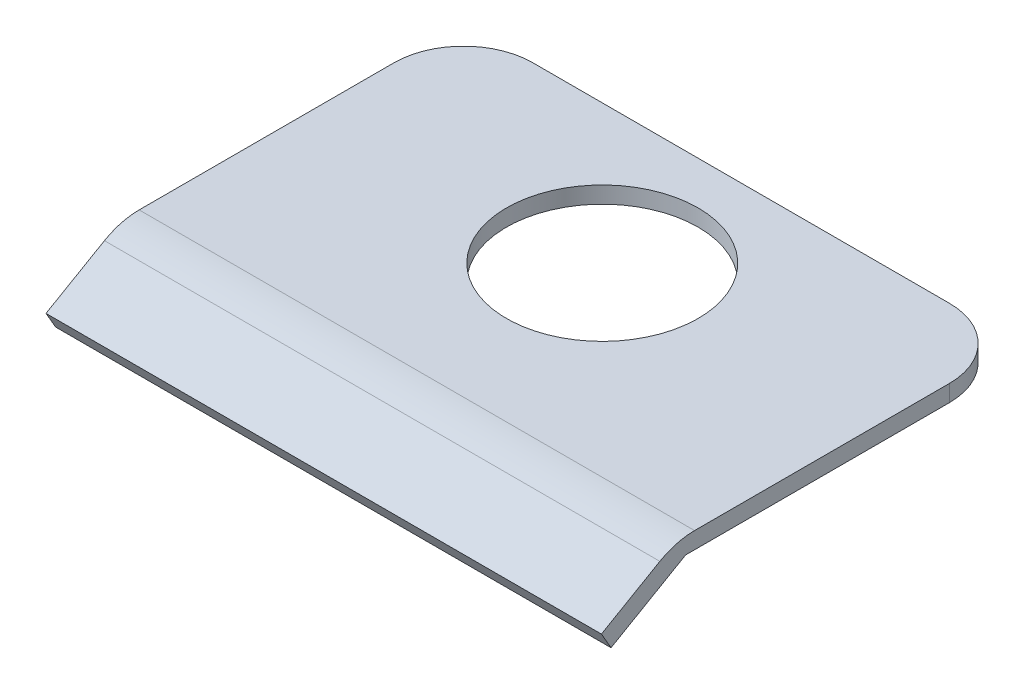
ISO-10303-21;
HEADER;
FILE_DESCRIPTION(('STEP AP214'),'2;1');
FILE_NAME('part.step','',(''),(''),'','','');
FILE_SCHEMA(('AUTOMOTIVE_DESIGN { 1 0 10303 214 1 1 1 1 }'));
ENDSEC;
DATA;
#1=APPLICATION_CONTEXT('core data for automotive mechanical design processes');
#2=APPLICATION_PROTOCOL_DEFINITION('international standard','automotive_design',2000,#1);
#3=PRODUCT_CONTEXT('',#1,'mechanical');
#4=PRODUCT('Part','Part','',(#3));
#5=PRODUCT_RELATED_PRODUCT_CATEGORY('part','',(#4));
#6=PRODUCT_DEFINITION_FORMATION('','',#4);
#7=PRODUCT_DEFINITION_CONTEXT('part definition',#1,'design');
#8=PRODUCT_DEFINITION('design','',#6,#7);
#9=PRODUCT_DEFINITION_SHAPE('','',#8);
#10=(LENGTH_UNIT() NAMED_UNIT(*) SI_UNIT(.MILLI.,.METRE.));
#11=(NAMED_UNIT(*) PLANE_ANGLE_UNIT() SI_UNIT($,.RADIAN.));
#12=(NAMED_UNIT(*) SI_UNIT($,.STERADIAN.) SOLID_ANGLE_UNIT());
#13=UNCERTAINTY_MEASURE_WITH_UNIT(LENGTH_MEASURE(1.E-05),#10,'distance_accuracy_value','');
#14=(GEOMETRIC_REPRESENTATION_CONTEXT(3) GLOBAL_UNCERTAINTY_ASSIGNED_CONTEXT((#13)) GLOBAL_UNIT_ASSIGNED_CONTEXT((#10,
#11,#12)) REPRESENTATION_CONTEXT('',''));
#15=CARTESIAN_POINT('',(0.,0.,0.));
#16=DIRECTION('',(0.,0.,1.));
#17=DIRECTION('',(1.,0.,0.));
#18=AXIS2_PLACEMENT_3D('',#15,#16,#17);
#19=CARTESIAN_POINT('',(0.,1.524,0.));
#20=DIRECTION('',(0.,1.,0.));
#21=DIRECTION('',(0.,0.,1.));
#22=AXIS2_PLACEMENT_3D('',#19,#20,#21);
#23=PLANE('',#22);
#24=DIRECTION('',(0.,0.,1.));
#25=VECTOR('',#24,1.);
#26=CARTESIAN_POINT('',(-25.4,1.524,-15.24));
#27=LINE('',#26,#25);
#28=CARTESIAN_POINT('',(-25.4,1.524,-8.89));
#29=VERTEX_POINT('',#28);
#30=CARTESIAN_POINT('',(-25.4,1.524,14.4184044383074));
#31=VERTEX_POINT('',#30);
#32=EDGE_CURVE('E163',#29,#31,#27,.T.);
#33=ORIENTED_EDGE('',*,*,#32,.T.);
#34=DIRECTION('',(-1.,0.,0.));
#35=VECTOR('',#34,1.);
#36=CARTESIAN_POINT('',(0.,1.524,14.4184044383074));
#37=LINE('',#36,#35);
#38=CARTESIAN_POINT('',(25.4,1.524,14.4184044383073));
#39=VERTEX_POINT('',#38);
#40=EDGE_CURVE('E178',#31,#39,#37,.F.);
#41=ORIENTED_EDGE('',*,*,#40,.T.);
#42=DIRECTION('',(0.,0.,-1.));
#43=VECTOR('',#42,1.);
#44=CARTESIAN_POINT('',(25.4,1.524,-15.24));
#45=LINE('',#44,#43);
#46=CARTESIAN_POINT('',(25.4,1.524,-8.89000000000001));
#47=VERTEX_POINT('',#46);
#48=EDGE_CURVE('E131',#39,#47,#45,.T.);
#49=ORIENTED_EDGE('',*,*,#48,.T.);
#50=CARTESIAN_POINT('',(19.05,1.524,-8.89));
#51=DIRECTION('',(0.,1.,0.));
#52=DIRECTION('',(0.,0.,1.));
#53=AXIS2_PLACEMENT_3D('',#50,#51,#52);
#54=CIRCLE('',#53,6.35);
#55=CARTESIAN_POINT('',(19.05,1.524,-15.24));
#56=VERTEX_POINT('',#55);
#57=EDGE_CURVE('E174',#47,#56,#54,.T.);
#58=ORIENTED_EDGE('',*,*,#57,.T.);
#59=DIRECTION('',(-1.,0.,0.));
#60=VECTOR('',#59,1.);
#61=CARTESIAN_POINT('',(-25.4,1.524,-15.24));
#62=LINE('',#61,#60);
#63=CARTESIAN_POINT('',(-19.05,1.524,-15.24));
#64=VERTEX_POINT('',#63);
#65=EDGE_CURVE('E160',#56,#64,#62,.T.);
#66=ORIENTED_EDGE('',*,*,#65,.T.);
#67=CARTESIAN_POINT('',(-19.05,1.524,-8.89));
#68=DIRECTION('',(0.,1.,0.));
#69=DIRECTION('',(0.,0.,1.));
#70=AXIS2_PLACEMENT_3D('',#67,#68,#69);
#71=CIRCLE('',#70,6.35);
#72=EDGE_CURVE('E176',#64,#29,#71,.T.);
#73=ORIENTED_EDGE('',*,*,#72,.T.);
#74=EDGE_LOOP('',(#33,#41,#49,#58,#66,#73));
#75=FACE_BOUND('',#74,.T.);
#76=CARTESIAN_POINT('',(0.,1.524,-2.54));
#77=DIRECTION('',(0.,1.,0.));
#78=DIRECTION('',(0.,0.,1.));
#79=AXIS2_PLACEMENT_3D('',#76,#77,#78);
#80=CIRCLE('',#79,8.76299999999999);
#81=CARTESIAN_POINT('',(0.,1.524,-11.303));
#82=VERTEX_POINT('',#81);
#83=EDGE_CURVE('E153',#82,#82,#80,.T.);
#84=ORIENTED_EDGE('',*,*,#83,.F.);
#85=EDGE_LOOP('',(#84));
#86=FACE_BOUND('',#85,.T.);
#87=ADVANCED_FACE('F38',(#75,#86),#23,.T.);
#88=CARTESIAN_POINT('',(0.,0.,0.));
#89=DIRECTION('',(0.,1.,0.));
#90=DIRECTION('',(0.,0.,1.));
#91=AXIS2_PLACEMENT_3D('',#88,#89,#90);
#92=PLANE('',#91);
#93=DIRECTION('',(0.,0.,1.));
#94=VECTOR('',#93,1.);
#95=CARTESIAN_POINT('',(-25.4,0.,-15.24));
#96=LINE('',#95,#94);
#97=CARTESIAN_POINT('',(-25.4,0.,-8.89));
#98=VERTEX_POINT('',#97);
#99=CARTESIAN_POINT('',(-25.4,0.,15.24));
#100=VERTEX_POINT('',#99);
#101=EDGE_CURVE('E110',#98,#100,#96,.T.);
#102=ORIENTED_EDGE('',*,*,#101,.F.);
#103=CARTESIAN_POINT('',(-19.05,0.,-8.89));
#104=DIRECTION('',(0.,1.,0.));
#105=DIRECTION('',(0.,0.,1.));
#106=AXIS2_PLACEMENT_3D('',#103,#104,#105);
#107=CIRCLE('',#106,6.35);
#108=CARTESIAN_POINT('',(-19.05,0.,-15.24));
#109=VERTEX_POINT('',#108);
#110=EDGE_CURVE('E53',#98,#109,#107,.F.);
#111=ORIENTED_EDGE('',*,*,#110,.T.);
#112=DIRECTION('',(-1.,0.,0.));
#113=VECTOR('',#112,1.);
#114=CARTESIAN_POINT('',(-25.4,0.,-15.24));
#115=LINE('',#114,#113);
#116=CARTESIAN_POINT('',(19.05,0.,-15.24));
#117=VERTEX_POINT('',#116);
#118=EDGE_CURVE('E121',#117,#109,#115,.T.);
#119=ORIENTED_EDGE('',*,*,#118,.F.);
#120=CARTESIAN_POINT('',(19.05,0.,-8.89));
#121=DIRECTION('',(0.,1.,0.));
#122=DIRECTION('',(0.,0.,1.));
#123=AXIS2_PLACEMENT_3D('',#120,#121,#122);
#124=CIRCLE('',#123,6.35);
#125=CARTESIAN_POINT('',(25.4,0.,-8.89000000000001));
#126=VERTEX_POINT('',#125);
#127=EDGE_CURVE('E61',#117,#126,#124,.F.);
#128=ORIENTED_EDGE('',*,*,#127,.T.);
#129=DIRECTION('',(0.,0.,-1.));
#130=VECTOR('',#129,1.);
#131=CARTESIAN_POINT('',(25.4,0.,-15.24));
#132=LINE('',#131,#130);
#133=CARTESIAN_POINT('',(25.4,0.,15.24));
#134=VERTEX_POINT('',#133);
#135=EDGE_CURVE('E127',#134,#126,#132,.T.);
#136=ORIENTED_EDGE('',*,*,#135,.F.);
#137=DIRECTION('',(1.,0.,0.));
#138=VECTOR('',#137,1.);
#139=CARTESIAN_POINT('',(-25.4,0.,15.24));
#140=LINE('',#139,#138);
#141=EDGE_CURVE('E120',#100,#134,#140,.T.);
#142=ORIENTED_EDGE('',*,*,#141,.F.);
#143=EDGE_LOOP('',(#102,#111,#119,#128,#136,#142));
#144=FACE_BOUND('',#143,.T.);
#145=CARTESIAN_POINT('',(0.,0.,-2.54));
#146=DIRECTION('',(0.,1.,0.));
#147=DIRECTION('',(0.,0.,1.));
#148=AXIS2_PLACEMENT_3D('',#145,#146,#147);
#149=CIRCLE('',#148,8.76299999999999);
#150=CARTESIAN_POINT('',(0.,0.,-11.303));
#151=VERTEX_POINT('',#150);
#152=EDGE_CURVE('E152',#151,#151,#149,.T.);
#153=ORIENTED_EDGE('',*,*,#152,.T.);
#154=EDGE_LOOP('',(#153));
#155=FACE_BOUND('',#154,.T.);
#156=ADVANCED_FACE('F124',(#144,#155),#92,.F.);
#157=CARTESIAN_POINT('',(25.4,1.524,-15.24));
#158=DIRECTION('',(-1.,0.,0.));
#159=DIRECTION('',(0.,0.,1.));
#160=AXIS2_PLACEMENT_3D('',#157,#158,#159);
#161=PLANE('',#160);
#162=ORIENTED_EDGE('',*,*,#48,.F.);
#163=CARTESIAN_POINT('',(25.4,-4.826,14.4184044383074));
#164=DIRECTION('',(-1.,0.,0.));
#165=DIRECTION('',(0.,0.,1.));
#166=AXIS2_PLACEMENT_3D('',#163,#164,#165);
#167=CIRCLE('',#166,6.35);
#168=CARTESIAN_POINT('',(25.4,0.673261314031206,17.5934044383073));
#169=VERTEX_POINT('',#168);
#170=EDGE_CURVE('E182',#39,#169,#167,.F.);
#171=ORIENTED_EDGE('',*,*,#170,.T.);
#172=DIRECTION('',(0.,-0.499999999999995,0.866025403784442));
#173=VECTOR('',#172,1.);
#174=CARTESIAN_POINT('',(25.4,1.524,16.119881810245));
#175=LINE('',#174,#173);
#176=CARTESIAN_POINT('',(25.4,-2.41299999999996,22.9389658396437));
#177=VERTEX_POINT('',#176);
#178=EDGE_CURVE('E142',#169,#177,#175,.T.);
#179=ORIENTED_EDGE('',*,*,#178,.T.);
#180=DIRECTION('',(0.,-0.866025403784442,-0.499999999999995));
#181=VECTOR('',#180,1.);
#182=CARTESIAN_POINT('',(25.4,-3.93699999999995,22.0590840293987));
#183=LINE('',#182,#181);
#184=CARTESIAN_POINT('',(25.4,-3.93699999999995,22.0590840293987));
#185=VERTEX_POINT('',#184);
#186=EDGE_CURVE('E148',#177,#185,#183,.T.);
#187=ORIENTED_EDGE('',*,*,#186,.T.);
#188=DIRECTION('',(0.,0.499999999999994,-0.866025403784442));
#189=VECTOR('',#188,1.);
#190=CARTESIAN_POINT('',(25.4,0.,15.24));
#191=LINE('',#190,#189);
#192=EDGE_CURVE('E150',#185,#134,#191,.T.);
#193=ORIENTED_EDGE('',*,*,#192,.T.);
#194=ORIENTED_EDGE('',*,*,#135,.T.);
#195=DIRECTION('',(0.,-1.,0.));
#196=VECTOR('',#195,1.);
#197=CARTESIAN_POINT('',(25.4,1.524,-8.89));
#198=LINE('',#197,#196);
#199=EDGE_CURVE('E180',#126,#47,#198,.F.);
#200=ORIENTED_EDGE('',*,*,#199,.T.);
#201=EDGE_LOOP('',(#162,#171,#179,#187,#193,#194,#200));
#202=FACE_BOUND('',#201,.T.);
#203=ADVANCED_FACE('F192',(#202),#161,.F.);
#204=CARTESIAN_POINT('',(-25.4,1.524,-15.24));
#205=DIRECTION('',(0.,0.,1.));
#206=DIRECTION('',(1.,0.,0.));
#207=AXIS2_PLACEMENT_3D('',#204,#205,#206);
#208=PLANE('',#207);
#209=ORIENTED_EDGE('',*,*,#118,.T.);
#210=DIRECTION('',(0.,-1.,0.));
#211=VECTOR('',#210,1.);
#212=CARTESIAN_POINT('',(-19.05,1.524,-15.24));
#213=LINE('',#212,#211);
#214=EDGE_CURVE('E11',#109,#64,#213,.F.);
#215=ORIENTED_EDGE('',*,*,#214,.T.);
#216=ORIENTED_EDGE('',*,*,#65,.F.);
#217=DIRECTION('',(0.,-1.,0.));
#218=VECTOR('',#217,1.);
#219=CARTESIAN_POINT('',(19.05,1.524,-15.24));
#220=LINE('',#219,#218);
#221=EDGE_CURVE('E46',#56,#117,#220,.T.);
#222=ORIENTED_EDGE('',*,*,#221,.T.);
#223=EDGE_LOOP('',(#209,#215,#216,#222));
#224=FACE_BOUND('',#223,.T.);
#225=ADVANCED_FACE('F187',(#224),#208,.F.);
#226=CARTESIAN_POINT('',(-25.4,1.524,-15.24));
#227=DIRECTION('',(1.,0.,0.));
#228=DIRECTION('',(0.,0.,-1.));
#229=AXIS2_PLACEMENT_3D('',#226,#227,#228);
#230=PLANE('',#229);
#231=DIRECTION('',(0.,0.499999999999995,-0.866025403784442));
#232=VECTOR('',#231,1.);
#233=CARTESIAN_POINT('',(-25.4,1.524,16.119881810245));
#234=LINE('',#233,#232);
#235=CARTESIAN_POINT('',(-25.4,-2.41299999999996,22.9389658396437));
#236=VERTEX_POINT('',#235);
#237=CARTESIAN_POINT('',(-25.4,0.673261314031205,17.5934044383073));
#238=VERTEX_POINT('',#237);
#239=EDGE_CURVE('E139',#236,#238,#234,.T.);
#240=ORIENTED_EDGE('',*,*,#239,.T.);
#241=CARTESIAN_POINT('',(-25.4,-4.826,14.4184044383074));
#242=DIRECTION('',(1.,0.,0.));
#243=DIRECTION('',(0.,0.,-1.));
#244=AXIS2_PLACEMENT_3D('',#241,#242,#243);
#245=CIRCLE('',#244,6.35);
#246=EDGE_CURVE('E172',#238,#31,#245,.F.);
#247=ORIENTED_EDGE('',*,*,#246,.T.);
#248=ORIENTED_EDGE('',*,*,#32,.F.);
#249=DIRECTION('',(0.,-1.,0.));
#250=VECTOR('',#249,1.);
#251=CARTESIAN_POINT('',(-25.4,1.524,-8.89));
#252=LINE('',#251,#250);
#253=EDGE_CURVE('E119',#29,#98,#252,.T.);
#254=ORIENTED_EDGE('',*,*,#253,.T.);
#255=ORIENTED_EDGE('',*,*,#101,.T.);
#256=DIRECTION('',(0.,-0.499999999999994,0.866025403784442));
#257=VECTOR('',#256,1.);
#258=CARTESIAN_POINT('',(-25.4,0.,15.24));
#259=LINE('',#258,#257);
#260=CARTESIAN_POINT('',(-25.4,-3.93699999999995,22.0590840293987));
#261=VERTEX_POINT('',#260);
#262=EDGE_CURVE('E116',#100,#261,#259,.T.);
#263=ORIENTED_EDGE('',*,*,#262,.T.);
#264=DIRECTION('',(0.,0.866025403784442,0.499999999999994));
#265=VECTOR('',#264,1.);
#266=CARTESIAN_POINT('',(-25.4,-3.93699999999995,22.0590840293987));
#267=LINE('',#266,#265);
#268=EDGE_CURVE('E137',#261,#236,#267,.T.);
#269=ORIENTED_EDGE('',*,*,#268,.T.);
#270=EDGE_LOOP('',(#240,#247,#248,#254,#255,#263,#269));
#271=FACE_BOUND('',#270,.T.);
#272=ADVANCED_FACE('F113',(#271),#230,.F.);
#273=CARTESIAN_POINT('',(0.,1.524,-2.54));
#274=DIRECTION('',(0.,-1.,0.));
#275=DIRECTION('',(0.,0.,-1.));
#276=AXIS2_PLACEMENT_3D('',#273,#274,#275);
#277=CYLINDRICAL_SURFACE('',#276,8.76299999999999);
#278=CARTESIAN_POINT('',(0.,1.524,-11.303));
#279=CARTESIAN_POINT('',(0.,1.508125,-11.303));
#280=CARTESIAN_POINT('',(0.,1.49225,-11.303));
#281=CARTESIAN_POINT('',(0.,1.4605,-11.303));
#282=CARTESIAN_POINT('',(0.,1.444625,-11.303));
#283=CARTESIAN_POINT('',(0.,1.412875,-11.303));
#284=CARTESIAN_POINT('',(0.,1.397,-11.303));
#285=CARTESIAN_POINT('',(0.,1.36525,-11.303));
#286=CARTESIAN_POINT('',(0.,1.349375,-11.303));
#287=CARTESIAN_POINT('',(0.,1.317625,-11.303));
#288=CARTESIAN_POINT('',(0.,1.30175,-11.303));
#289=CARTESIAN_POINT('',(0.,1.27,-11.303));
#290=CARTESIAN_POINT('',(0.,1.254125,-11.303));
#291=CARTESIAN_POINT('',(0.,1.222375,-11.303));
#292=CARTESIAN_POINT('',(0.,1.2065,-11.303));
#293=CARTESIAN_POINT('',(0.,1.17475,-11.303));
#294=CARTESIAN_POINT('',(0.,1.158875,-11.303));
#295=CARTESIAN_POINT('',(0.,1.127125,-11.303));
#296=CARTESIAN_POINT('',(0.,1.11125,-11.303));
#297=CARTESIAN_POINT('',(0.,1.0795,-11.303));
#298=CARTESIAN_POINT('',(0.,1.063625,-11.303));
#299=CARTESIAN_POINT('',(0.,1.031875,-11.303));
#300=CARTESIAN_POINT('',(0.,1.016,-11.303));
#301=CARTESIAN_POINT('',(0.,0.98425,-11.303));
#302=CARTESIAN_POINT('',(0.,0.968375,-11.303));
#303=CARTESIAN_POINT('',(0.,0.936625,-11.303));
#304=CARTESIAN_POINT('',(0.,0.92075,-11.303));
#305=CARTESIAN_POINT('',(0.,0.889,-11.303));
#306=CARTESIAN_POINT('',(0.,0.873125,-11.303));
#307=CARTESIAN_POINT('',(0.,0.841375,-11.303));
#308=CARTESIAN_POINT('',(0.,0.8255,-11.303));
#309=CARTESIAN_POINT('',(0.,0.79375,-11.303));
#310=CARTESIAN_POINT('',(0.,0.777875,-11.303));
#311=CARTESIAN_POINT('',(0.,0.746125,-11.303));
#312=CARTESIAN_POINT('',(0.,0.73025,-11.303));
#313=CARTESIAN_POINT('',(0.,0.6985,-11.303));
#314=CARTESIAN_POINT('',(0.,0.682625,-11.303));
#315=CARTESIAN_POINT('',(0.,0.650875,-11.303));
#316=CARTESIAN_POINT('',(0.,0.635,-11.303));
#317=CARTESIAN_POINT('',(0.,0.60325,-11.303));
#318=CARTESIAN_POINT('',(0.,0.587375,-11.303));
#319=CARTESIAN_POINT('',(0.,0.555625,-11.303));
#320=CARTESIAN_POINT('',(0.,0.53975,-11.303));
#321=CARTESIAN_POINT('',(0.,0.508,-11.303));
#322=CARTESIAN_POINT('',(0.,0.492125,-11.303));
#323=CARTESIAN_POINT('',(0.,0.460375,-11.303));
#324=CARTESIAN_POINT('',(0.,0.4445,-11.303));
#325=CARTESIAN_POINT('',(0.,0.41275,-11.303));
#326=CARTESIAN_POINT('',(0.,0.396875,-11.303));
#327=CARTESIAN_POINT('',(0.,0.365125,-11.303));
#328=CARTESIAN_POINT('',(0.,0.34925,-11.303));
#329=CARTESIAN_POINT('',(0.,0.3175,-11.303));
#330=CARTESIAN_POINT('',(0.,0.301625,-11.303));
#331=CARTESIAN_POINT('',(0.,0.269875,-11.303));
#332=CARTESIAN_POINT('',(0.,0.254,-11.303));
#333=CARTESIAN_POINT('',(0.,0.22225,-11.303));
#334=CARTESIAN_POINT('',(0.,0.206375,-11.303));
#335=CARTESIAN_POINT('',(0.,0.174625,-11.303));
#336=CARTESIAN_POINT('',(0.,0.15875,-11.303));
#337=CARTESIAN_POINT('',(0.,0.127,-11.303));
#338=CARTESIAN_POINT('',(0.,0.111125,-11.303));
#339=CARTESIAN_POINT('',(0.,0.079375,-11.303));
#340=CARTESIAN_POINT('',(0.,0.0635,-11.303));
#341=CARTESIAN_POINT('',(0.,0.0317499999999999,-11.303));
#342=CARTESIAN_POINT('',(0.,0.015875,-11.303));
#343=CARTESIAN_POINT('',(0.,0.,-11.303));
#344=B_SPLINE_CURVE_WITH_KNOTS('',3,(#278,#279,#280,#281,#282,#283,#284,#285,#286,#287,#288,
#289,#290,#291,#292,#293,#294,#295,#296,#297,#298,#299,#300,#301,#302,#303,#304,#305,#306,#307,
#308,#309,#310,#311,#312,#313,#314,#315,#316,#317,#318,#319,#320,#321,#322,#323,#324,#325,#326,
#327,#328,#329,#330,#331,#332,#333,#334,#335,#336,#337,#338,#339,#340,#341,#342,#343),
.UNSPECIFIED.,.F.,.F.,(4,2,2,2,2,2,2,2,2,2,2,2,2,2,2,2,2,2,2,2,2,2,2,2,2,2,2,2,2,2,2,2,4),(0.,
0.0476250000000001,0.0952500000000001,0.142875,0.1905,0.238125,0.28575,0.333375,0.381,0.428625,
0.47625,0.523875,0.5715,0.619125,0.66675,0.714375,0.762,0.809625,0.85725,0.904875,0.9525,
1.000125,1.04775,1.095375,1.143,1.190625,1.23825,1.285875,1.3335,1.381125,1.42875,1.476375,
1.524),.UNSPECIFIED.);
#345=EDGE_CURVE('BSEAM217',#82,#151,#344,.T.);
#346=ORIENTED_EDGE('',*,*,#83,.T.);
#347=ORIENTED_EDGE('',*,*,#152,.F.);
#348=ORIENTED_EDGE('',*,*,#345,.T.);
#349=ORIENTED_EDGE('',*,*,#345,.F.);
#350=EDGE_LOOP('',(#346,#348,#347,#349));
#351=FACE_BOUND('',#350,.T.);
#352=ADVANCED_FACE('F217',(#351),#277,.F.);
#353=CARTESIAN_POINT('',(34.8390993214395,1.524,16.119881810245));
#354=DIRECTION('',(0.,0.866025403784442,0.499999999999995));
#355=DIRECTION('',(0.,-0.499999999999995,0.866025403784442));
#356=AXIS2_PLACEMENT_3D('',#353,#354,#355);
#357=PLANE('',#356);
#358=ORIENTED_EDGE('',*,*,#178,.F.);
#359=DIRECTION('',(-1.,0.,0.));
#360=VECTOR('',#359,1.);
#361=CARTESIAN_POINT('',(34.8390993214395,0.673261314031205,17.5934044383073));
#362=LINE('',#361,#360);
#363=EDGE_CURVE('E166',#169,#238,#362,.T.);
#364=ORIENTED_EDGE('',*,*,#363,.T.);
#365=ORIENTED_EDGE('',*,*,#239,.F.);
#366=DIRECTION('',(-1.,0.,0.));
#367=VECTOR('',#366,1.);
#368=CARTESIAN_POINT('',(34.8390993214395,-2.41299999999996,22.9389658396437));
#369=LINE('',#368,#367);
#370=EDGE_CURVE('E146',#177,#236,#369,.T.);
#371=ORIENTED_EDGE('',*,*,#370,.F.);
#372=EDGE_LOOP('',(#358,#364,#365,#371));
#373=FACE_BOUND('',#372,.T.);
#374=ADVANCED_FACE('F204',(#373),#357,.T.);
#375=CARTESIAN_POINT('',(34.8390993214395,-3.93699999999995,22.0590840293987));
#376=DIRECTION('',(0.,-0.499999999999994,0.866025403784442));
#377=DIRECTION('',(0.,-0.866025403784442,-0.499999999999995));
#378=AXIS2_PLACEMENT_3D('',#375,#376,#377);
#379=PLANE('',#378);
#380=ORIENTED_EDGE('',*,*,#186,.F.);
#381=ORIENTED_EDGE('',*,*,#370,.T.);
#382=ORIENTED_EDGE('',*,*,#268,.F.);
#383=DIRECTION('',(-1.,0.,0.));
#384=VECTOR('',#383,1.);
#385=CARTESIAN_POINT('',(34.8390993214395,-3.93699999999995,22.0590840293987));
#386=LINE('',#385,#384);
#387=EDGE_CURVE('E135',#185,#261,#386,.T.);
#388=ORIENTED_EDGE('',*,*,#387,.F.);
#389=EDGE_LOOP('',(#380,#381,#382,#388));
#390=FACE_BOUND('',#389,.T.);
#391=ADVANCED_FACE('F208',(#390),#379,.T.);
#392=CARTESIAN_POINT('',(34.8390993214395,0.,15.24));
#393=DIRECTION('',(0.,-0.866025403784442,-0.499999999999994));
#394=DIRECTION('',(0.,0.499999999999994,-0.866025403784442));
#395=AXIS2_PLACEMENT_3D('',#392,#393,#394);
#396=PLANE('',#395);
#397=ORIENTED_EDGE('',*,*,#192,.F.);
#398=ORIENTED_EDGE('',*,*,#387,.T.);
#399=ORIENTED_EDGE('',*,*,#262,.F.);
#400=ORIENTED_EDGE('',*,*,#141,.T.);
#401=EDGE_LOOP('',(#397,#398,#399,#400));
#402=FACE_BOUND('',#401,.T.);
#403=ADVANCED_FACE('F133',(#402),#396,.T.);
#404=CARTESIAN_POINT('',(34.8390993214395,-4.826,14.4184044383074));
#405=DIRECTION('',(-1.,0.,0.));
#406=DIRECTION('',(0.,0.,1.));
#407=AXIS2_PLACEMENT_3D('',#404,#405,#406);
#408=CYLINDRICAL_SURFACE('',#407,6.35);
#409=ORIENTED_EDGE('',*,*,#170,.F.);
#410=ORIENTED_EDGE('',*,*,#40,.F.);
#411=ORIENTED_EDGE('',*,*,#246,.F.);
#412=ORIENTED_EDGE('',*,*,#363,.F.);
#413=EDGE_LOOP('',(#409,#410,#411,#412));
#414=FACE_BOUND('',#413,.T.);
#415=ADVANCED_FACE('F201',(#414),#408,.T.);
#416=CARTESIAN_POINT('',(-19.05,1.524,-8.89));
#417=DIRECTION('',(0.,-1.,0.));
#418=DIRECTION('',(0.,0.,-1.));
#419=AXIS2_PLACEMENT_3D('',#416,#417,#418);
#420=CYLINDRICAL_SURFACE('',#419,6.35);
#421=ORIENTED_EDGE('',*,*,#72,.F.);
#422=ORIENTED_EDGE('',*,*,#214,.F.);
#423=ORIENTED_EDGE('',*,*,#110,.F.);
#424=ORIENTED_EDGE('',*,*,#253,.F.);
#425=EDGE_LOOP('',(#421,#422,#423,#424));
#426=FACE_BOUND('',#425,.T.);
#427=ADVANCED_FACE('F234',(#426),#420,.T.);
#428=CARTESIAN_POINT('',(19.05,1.524,-8.89));
#429=DIRECTION('',(0.,-1.,0.));
#430=DIRECTION('',(0.,0.,-1.));
#431=AXIS2_PLACEMENT_3D('',#428,#429,#430);
#432=CYLINDRICAL_SURFACE('',#431,6.35);
#433=ORIENTED_EDGE('',*,*,#57,.F.);
#434=ORIENTED_EDGE('',*,*,#199,.F.);
#435=ORIENTED_EDGE('',*,*,#127,.F.);
#436=ORIENTED_EDGE('',*,*,#221,.F.);
#437=EDGE_LOOP('',(#433,#434,#435,#436));
#438=FACE_BOUND('',#437,.T.);
#439=ADVANCED_FACE('F40',(#438),#432,.T.);
#440=CLOSED_SHELL('',(#87,#156,#203,#225,#272,#352,#374,#391,#403,#415,#427,#439));
#441=MANIFOLD_SOLID_BREP('B2',#440);
#442=ADVANCED_BREP_SHAPE_REPRESENTATION('',(#18,#441),#14);
#443=SHAPE_DEFINITION_REPRESENTATION(#9,#442);
ENDSEC;
END-ISO-10303-21;
